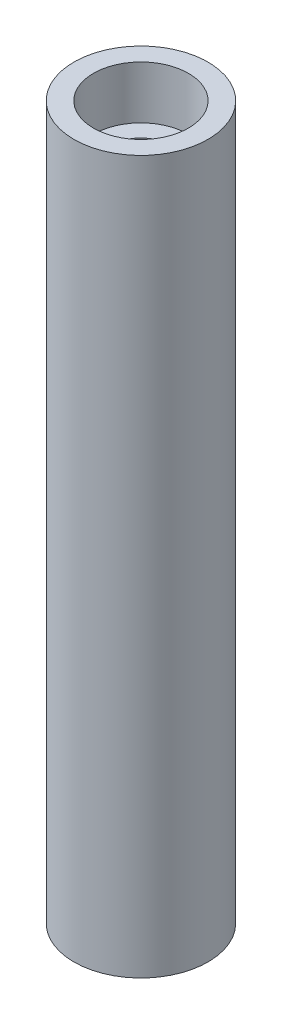
ISO-10303-21;
HEADER;
FILE_DESCRIPTION(('STEP AP214'),'2;1');
FILE_NAME('part.step','',(''),(''),'','','');
FILE_SCHEMA(('AUTOMOTIVE_DESIGN { 1 0 10303 214 1 1 1 1 }'));
ENDSEC;
DATA;
#1=APPLICATION_CONTEXT('core data for automotive mechanical design processes');
#2=APPLICATION_PROTOCOL_DEFINITION('international standard','automotive_design',2000,#1);
#3=PRODUCT_CONTEXT('',#1,'mechanical');
#4=PRODUCT('Part','Part','',(#3));
#5=PRODUCT_RELATED_PRODUCT_CATEGORY('part','',(#4));
#6=PRODUCT_DEFINITION_FORMATION('','',#4);
#7=PRODUCT_DEFINITION_CONTEXT('part definition',#1,'design');
#8=PRODUCT_DEFINITION('design','',#6,#7);
#9=PRODUCT_DEFINITION_SHAPE('','',#8);
#10=(LENGTH_UNIT() NAMED_UNIT(*) SI_UNIT(.MILLI.,.METRE.));
#11=(NAMED_UNIT(*) PLANE_ANGLE_UNIT() SI_UNIT($,.RADIAN.));
#12=(NAMED_UNIT(*) SI_UNIT($,.STERADIAN.) SOLID_ANGLE_UNIT());
#13=UNCERTAINTY_MEASURE_WITH_UNIT(LENGTH_MEASURE(1.E-05),#10,'distance_accuracy_value','');
#14=(GEOMETRIC_REPRESENTATION_CONTEXT(3) GLOBAL_UNCERTAINTY_ASSIGNED_CONTEXT((#13)) GLOBAL_UNIT_ASSIGNED_CONTEXT((#10,
#11,#12)) REPRESENTATION_CONTEXT('',''));
#15=CARTESIAN_POINT('',(0.,0.,0.));
#16=DIRECTION('',(0.,0.,1.));
#17=DIRECTION('',(1.,0.,0.));
#18=AXIS2_PLACEMENT_3D('',#15,#16,#17);
#19=CARTESIAN_POINT('',(0.,135.,0.));
#20=DIRECTION('',(0.,-1.,0.));
#21=DIRECTION('',(0.,0.,-1.));
#22=AXIS2_PLACEMENT_3D('',#19,#20,#21);
#23=CYLINDRICAL_SURFACE('',#22,12.7);
#24=CARTESIAN_POINT('',(0.,135.,0.));
#25=DIRECTION('',(0.,1.,0.));
#26=DIRECTION('',(0.,0.,1.));
#27=AXIS2_PLACEMENT_3D('',#24,#25,#26);
#28=CIRCLE('',#27,12.7);
#29=CARTESIAN_POINT('',(0.,135.,12.7));
#30=VERTEX_POINT('',#29);
#31=EDGE_CURVE('E10',#30,#30,#28,.T.);
#32=ORIENTED_EDGE('',*,*,#31,.F.);
#33=EDGE_LOOP('',(#32));
#34=FACE_BOUND('',#33,.T.);
#35=CARTESIAN_POINT('',(0.,0.,0.));
#36=DIRECTION('',(0.,1.,0.));
#37=DIRECTION('',(0.,0.,1.));
#38=AXIS2_PLACEMENT_3D('',#35,#36,#37);
#39=CIRCLE('',#38,12.7);
#40=CARTESIAN_POINT('',(0.,0.,12.7));
#41=VERTEX_POINT('',#40);
#42=EDGE_CURVE('E40',#41,#41,#39,.T.);
#43=ORIENTED_EDGE('',*,*,#42,.T.);
#44=EDGE_LOOP('',(#43));
#45=FACE_BOUND('',#44,.T.);
#46=ADVANCED_FACE('F37',(#34,#45),#23,.T.);
#47=CARTESIAN_POINT('',(0.,135.,0.));
#48=DIRECTION('',(0.,1.,0.));
#49=DIRECTION('',(0.,0.,1.));
#50=AXIS2_PLACEMENT_3D('',#47,#48,#49);
#51=PLANE('',#50);
#52=CARTESIAN_POINT('',(0.,135.,0.));
#53=DIRECTION('',(0.,1.,0.));
#54=DIRECTION('',(0.,0.,1.));
#55=AXIS2_PLACEMENT_3D('',#52,#53,#54);
#56=CIRCLE('',#55,9.);
#57=CARTESIAN_POINT('',(0.,135.,9.));
#58=VERTEX_POINT('',#57);
#59=EDGE_CURVE('E57',#58,#58,#56,.T.);
#60=ORIENTED_EDGE('',*,*,#59,.F.);
#61=EDGE_LOOP('',(#60));
#62=FACE_BOUND('',#61,.T.);
#63=ORIENTED_EDGE('',*,*,#31,.T.);
#64=EDGE_LOOP('',(#63));
#65=FACE_BOUND('',#64,.T.);
#66=ADVANCED_FACE('F63',(#62,#65),#51,.T.);
#67=CARTESIAN_POINT('',(0.,0.,0.));
#68=DIRECTION('',(0.,1.,0.));
#69=DIRECTION('',(0.,0.,1.));
#70=AXIS2_PLACEMENT_3D('',#67,#68,#69);
#71=PLANE('',#70);
#72=CARTESIAN_POINT('',(0.,0.,0.));
#73=DIRECTION('',(0.,1.,0.));
#74=DIRECTION('',(0.,0.,1.));
#75=AXIS2_PLACEMENT_3D('',#72,#73,#74);
#76=CIRCLE('',#75,5.49999999999997);
#77=CARTESIAN_POINT('',(0.,0.,5.49999999999997));
#78=VERTEX_POINT('',#77);
#79=EDGE_CURVE('E47',#78,#78,#76,.T.);
#80=ORIENTED_EDGE('',*,*,#79,.T.);
#81=EDGE_LOOP('',(#80));
#82=FACE_BOUND('',#81,.T.);
#83=ORIENTED_EDGE('',*,*,#42,.F.);
#84=EDGE_LOOP('',(#83));
#85=FACE_BOUND('',#84,.T.);
#86=ADVANCED_FACE('F65',(#82,#85),#71,.F.);
#87=CARTESIAN_POINT('',(0.,135.,0.));
#88=DIRECTION('',(0.,1.,0.));
#89=DIRECTION('',(0.,0.,1.));
#90=AXIS2_PLACEMENT_3D('',#87,#88,#89);
#91=CYLINDRICAL_SURFACE('',#90,5.49999999999999);
#92=ORIENTED_EDGE('',*,*,#79,.F.);
#93=EDGE_LOOP('',(#92));
#94=FACE_BOUND('',#93,.T.);
#95=CARTESIAN_POINT('',(0.,125.,0.));
#96=DIRECTION('',(0.,1.,0.));
#97=DIRECTION('',(0.,0.,1.));
#98=AXIS2_PLACEMENT_3D('',#95,#96,#97);
#99=CIRCLE('',#98,5.50000000000001);
#100=CARTESIAN_POINT('',(0.,125.,5.50000000000001));
#101=VERTEX_POINT('',#100);
#102=EDGE_CURVE('E51',#101,#101,#99,.T.);
#103=ORIENTED_EDGE('',*,*,#102,.T.);
#104=EDGE_LOOP('',(#103));
#105=FACE_BOUND('',#104,.T.);
#106=ADVANCED_FACE('F71',(#94,#105),#91,.F.);
#107=CARTESIAN_POINT('',(5.50000000000001,125.,0.));
#108=DIRECTION('',(0.,-1.,0.));
#109=DIRECTION('',(0.,0.,-1.));
#110=AXIS2_PLACEMENT_3D('',#107,#108,#109);
#111=PLANE('',#110);
#112=ORIENTED_EDGE('',*,*,#102,.F.);
#113=EDGE_LOOP('',(#112));
#114=FACE_BOUND('',#113,.T.);
#115=CARTESIAN_POINT('',(0.,125.,0.));
#116=DIRECTION('',(0.,1.,0.));
#117=DIRECTION('',(0.,0.,1.));
#118=AXIS2_PLACEMENT_3D('',#115,#116,#117);
#119=CIRCLE('',#118,9.);
#120=CARTESIAN_POINT('',(0.,125.,9.));
#121=VERTEX_POINT('',#120);
#122=EDGE_CURVE('E54',#121,#121,#119,.T.);
#123=ORIENTED_EDGE('',*,*,#122,.T.);
#124=EDGE_LOOP('',(#123));
#125=FACE_BOUND('',#124,.T.);
#126=ADVANCED_FACE('F77',(#114,#125),#111,.F.);
#127=CARTESIAN_POINT('',(0.,135.,0.));
#128=DIRECTION('',(0.,1.,0.));
#129=DIRECTION('',(0.,0.,1.));
#130=AXIS2_PLACEMENT_3D('',#127,#128,#129);
#131=CYLINDRICAL_SURFACE('',#130,9.);
#132=ORIENTED_EDGE('',*,*,#122,.F.);
#133=EDGE_LOOP('',(#132));
#134=FACE_BOUND('',#133,.T.);
#135=ORIENTED_EDGE('',*,*,#59,.T.);
#136=EDGE_LOOP('',(#135));
#137=FACE_BOUND('',#136,.T.);
#138=ADVANCED_FACE('F61',(#134,#137),#131,.F.);
#139=CLOSED_SHELL('',(#46,#66,#86,#106,#126,#138));
#140=MANIFOLD_SOLID_BREP('B2',#139);
#141=ADVANCED_BREP_SHAPE_REPRESENTATION('',(#18,#140),#14);
#142=SHAPE_DEFINITION_REPRESENTATION(#9,#141);
ENDSEC;
END-ISO-10303-21;
